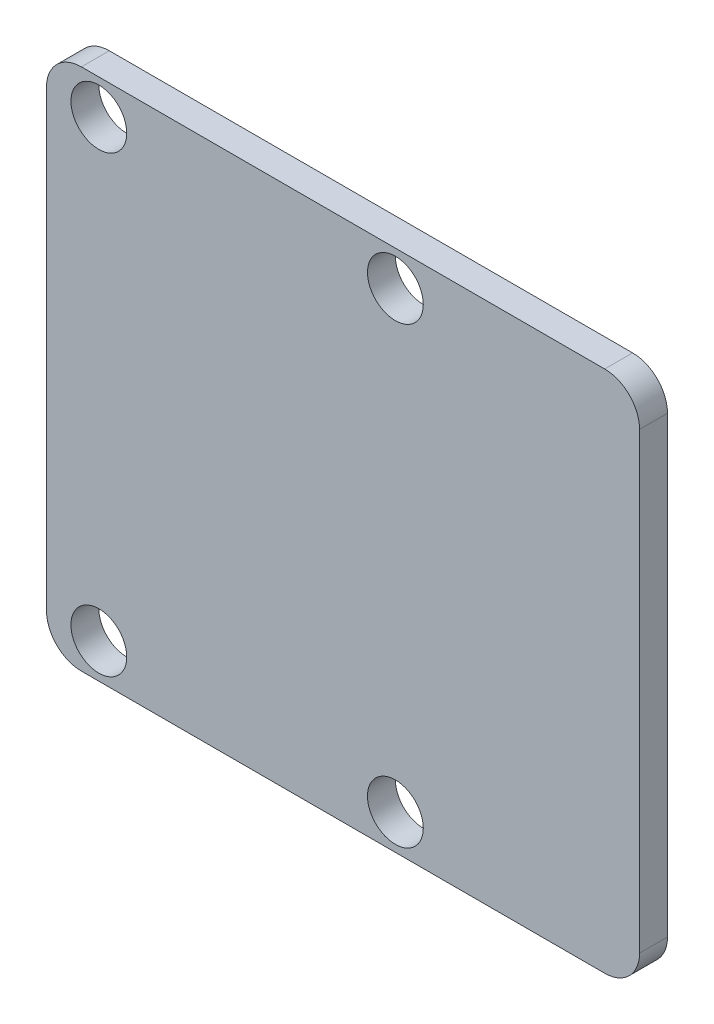
ISO-10303-21;
HEADER;
FILE_DESCRIPTION(('STEP AP214'),'2;1');
FILE_NAME('part.step','',(''),(''),'','','');
FILE_SCHEMA(('AUTOMOTIVE_DESIGN { 1 0 10303 214 1 1 1 1 }'));
ENDSEC;
DATA;
#1=APPLICATION_CONTEXT('core data for automotive mechanical design processes');
#2=APPLICATION_PROTOCOL_DEFINITION('international standard','automotive_design',2000,#1);
#3=PRODUCT_CONTEXT('',#1,'mechanical');
#4=PRODUCT('Part','Part','',(#3));
#5=PRODUCT_RELATED_PRODUCT_CATEGORY('part','',(#4));
#6=PRODUCT_DEFINITION_FORMATION('','',#4);
#7=PRODUCT_DEFINITION_CONTEXT('part definition',#1,'design');
#8=PRODUCT_DEFINITION('design','',#6,#7);
#9=PRODUCT_DEFINITION_SHAPE('','',#8);
#10=(LENGTH_UNIT() NAMED_UNIT(*) SI_UNIT(.MILLI.,.METRE.));
#11=(NAMED_UNIT(*) PLANE_ANGLE_UNIT() SI_UNIT($,.RADIAN.));
#12=(NAMED_UNIT(*) SI_UNIT($,.STERADIAN.) SOLID_ANGLE_UNIT());
#13=UNCERTAINTY_MEASURE_WITH_UNIT(LENGTH_MEASURE(1.E-05),#10,'distance_accuracy_value','');
#14=(GEOMETRIC_REPRESENTATION_CONTEXT(3) GLOBAL_UNCERTAINTY_ASSIGNED_CONTEXT((#13)) GLOBAL_UNIT_ASSIGNED_CONTEXT((#10,
#11,#12)) REPRESENTATION_CONTEXT('',''));
#15=CARTESIAN_POINT('',(0.,0.,0.));
#16=DIRECTION('',(0.,0.,1.));
#17=DIRECTION('',(1.,0.,0.));
#18=AXIS2_PLACEMENT_3D('',#15,#16,#17);
#19=CARTESIAN_POINT('',(17.,15.,1.6));
#20=DIRECTION('',(-1.,0.,0.));
#21=DIRECTION('',(0.,0.,1.));
#22=AXIS2_PLACEMENT_3D('',#19,#20,#21);
#23=PLANE('',#22);
#24=DIRECTION('',(0.,1.,0.));
#25=VECTOR('',#24,1.);
#26=CARTESIAN_POINT('',(17.,15.,0.));
#27=LINE('',#26,#25);
#28=CARTESIAN_POINT('',(17.,-13.,0.));
#29=VERTEX_POINT('',#28);
#30=CARTESIAN_POINT('',(17.,13.,0.));
#31=VERTEX_POINT('',#30);
#32=EDGE_CURVE('E126',#29,#31,#27,.T.);
#33=ORIENTED_EDGE('',*,*,#32,.T.);
#34=DIRECTION('',(0.,0.,-1.));
#35=VECTOR('',#34,1.);
#36=CARTESIAN_POINT('',(17.,13.,1.6));
#37=LINE('',#36,#35);
#38=CARTESIAN_POINT('',(17.,13.,1.6));
#39=VERTEX_POINT('',#38);
#40=EDGE_CURVE('E104',#31,#39,#37,.F.);
#41=ORIENTED_EDGE('',*,*,#40,.T.);
#42=DIRECTION('',(0.,1.,0.));
#43=VECTOR('',#42,1.);
#44=CARTESIAN_POINT('',(17.,15.,1.6));
#45=LINE('',#44,#43);
#46=CARTESIAN_POINT('',(17.,-13.,1.6));
#47=VERTEX_POINT('',#46);
#48=EDGE_CURVE('E136',#47,#39,#45,.T.);
#49=ORIENTED_EDGE('',*,*,#48,.F.);
#50=DIRECTION('',(0.,0.,-1.));
#51=VECTOR('',#50,1.);
#52=CARTESIAN_POINT('',(17.,-13.,1.6));
#53=LINE('',#52,#51);
#54=EDGE_CURVE('E109',#47,#29,#53,.T.);
#55=ORIENTED_EDGE('',*,*,#54,.T.);
#56=EDGE_LOOP('',(#33,#41,#49,#55));
#57=FACE_BOUND('',#56,.T.);
#58=ADVANCED_FACE('F33',(#57),#23,.F.);
#59=CARTESIAN_POINT('',(-17.,15.,1.6));
#60=DIRECTION('',(0.,-1.,0.));
#61=DIRECTION('',(0.,0.,-1.));
#62=AXIS2_PLACEMENT_3D('',#59,#60,#61);
#63=PLANE('',#62);
#64=DIRECTION('',(-1.,0.,0.));
#65=VECTOR('',#64,1.);
#66=CARTESIAN_POINT('',(-17.,15.,1.6));
#67=LINE('',#66,#65);
#68=CARTESIAN_POINT('',(15.,15.,1.6));
#69=VERTEX_POINT('',#68);
#70=CARTESIAN_POINT('',(-15.,15.,1.6));
#71=VERTEX_POINT('',#70);
#72=EDGE_CURVE('E119',#69,#71,#67,.T.);
#73=ORIENTED_EDGE('',*,*,#72,.F.);
#74=DIRECTION('',(0.,0.,-1.));
#75=VECTOR('',#74,1.);
#76=CARTESIAN_POINT('',(15.,15.,1.6));
#77=LINE('',#76,#75);
#78=CARTESIAN_POINT('',(15.,15.,0.));
#79=VERTEX_POINT('',#78);
#80=EDGE_CURVE('E103',#69,#79,#77,.T.);
#81=ORIENTED_EDGE('',*,*,#80,.T.);
#82=DIRECTION('',(-1.,0.,0.));
#83=VECTOR('',#82,1.);
#84=CARTESIAN_POINT('',(-17.,15.,0.));
#85=LINE('',#84,#83);
#86=CARTESIAN_POINT('',(-15.,15.,0.));
#87=VERTEX_POINT('',#86);
#88=EDGE_CURVE('E116',#79,#87,#85,.T.);
#89=ORIENTED_EDGE('',*,*,#88,.T.);
#90=DIRECTION('',(0.,0.,-1.));
#91=VECTOR('',#90,1.);
#92=CARTESIAN_POINT('',(-15.,15.,1.6));
#93=LINE('',#92,#91);
#94=EDGE_CURVE('E121',#87,#71,#93,.F.);
#95=ORIENTED_EDGE('',*,*,#94,.T.);
#96=EDGE_LOOP('',(#73,#81,#89,#95));
#97=FACE_BOUND('',#96,.T.);
#98=ADVANCED_FACE('F115',(#97),#63,.F.);
#99=CARTESIAN_POINT('',(-17.,15.,1.6));
#100=DIRECTION('',(1.,0.,0.));
#101=DIRECTION('',(0.,1.,0.));
#102=AXIS2_PLACEMENT_3D('',#99,#100,#101);
#103=PLANE('',#102);
#104=DIRECTION('',(0.,-1.,0.));
#105=VECTOR('',#104,1.);
#106=CARTESIAN_POINT('',(-17.,15.,0.));
#107=LINE('',#106,#105);
#108=CARTESIAN_POINT('',(-17.,13.,0.));
#109=VERTEX_POINT('',#108);
#110=CARTESIAN_POINT('',(-17.,-13.,0.));
#111=VERTEX_POINT('',#110);
#112=EDGE_CURVE('E125',#109,#111,#107,.T.);
#113=ORIENTED_EDGE('',*,*,#112,.T.);
#114=DIRECTION('',(0.,0.,-1.));
#115=VECTOR('',#114,1.);
#116=CARTESIAN_POINT('',(-17.,-13.,1.6));
#117=LINE('',#116,#115);
#118=CARTESIAN_POINT('',(-17.,-13.,1.6));
#119=VERTEX_POINT('',#118);
#120=EDGE_CURVE('E11',#111,#119,#117,.F.);
#121=ORIENTED_EDGE('',*,*,#120,.T.);
#122=DIRECTION('',(0.,-1.,0.));
#123=VECTOR('',#122,1.);
#124=CARTESIAN_POINT('',(-17.,15.,1.6));
#125=LINE('',#124,#123);
#126=CARTESIAN_POINT('',(-17.,13.,1.6));
#127=VERTEX_POINT('',#126);
#128=EDGE_CURVE('E162',#127,#119,#125,.T.);
#129=ORIENTED_EDGE('',*,*,#128,.F.);
#130=DIRECTION('',(0.,0.,-1.));
#131=VECTOR('',#130,1.);
#132=CARTESIAN_POINT('',(-17.,13.,1.6));
#133=LINE('',#132,#131);
#134=EDGE_CURVE('E41',#127,#109,#133,.T.);
#135=ORIENTED_EDGE('',*,*,#134,.T.);
#136=EDGE_LOOP('',(#113,#121,#129,#135));
#137=FACE_BOUND('',#136,.T.);
#138=ADVANCED_FACE('F160',(#137),#103,.F.);
#139=CARTESIAN_POINT('',(-17.,-15.,1.6));
#140=DIRECTION('',(0.,1.,0.));
#141=DIRECTION('',(0.,0.,1.));
#142=AXIS2_PLACEMENT_3D('',#139,#140,#141);
#143=PLANE('',#142);
#144=DIRECTION('',(1.,0.,0.));
#145=VECTOR('',#144,1.);
#146=CARTESIAN_POINT('',(-17.,-15.,0.));
#147=LINE('',#146,#145);
#148=CARTESIAN_POINT('',(-15.,-15.,0.));
#149=VERTEX_POINT('',#148);
#150=CARTESIAN_POINT('',(15.,-15.,0.));
#151=VERTEX_POINT('',#150);
#152=EDGE_CURVE('E129',#149,#151,#147,.T.);
#153=ORIENTED_EDGE('',*,*,#152,.T.);
#154=DIRECTION('',(0.,0.,-1.));
#155=VECTOR('',#154,1.);
#156=CARTESIAN_POINT('',(15.,-15.,1.6));
#157=LINE('',#156,#155);
#158=CARTESIAN_POINT('',(15.,-15.,1.6));
#159=VERTEX_POINT('',#158);
#160=EDGE_CURVE('E48',#151,#159,#157,.F.);
#161=ORIENTED_EDGE('',*,*,#160,.T.);
#162=DIRECTION('',(1.,0.,0.));
#163=VECTOR('',#162,1.);
#164=CARTESIAN_POINT('',(-17.,-15.,1.6));
#165=LINE('',#164,#163);
#166=CARTESIAN_POINT('',(-15.,-15.,1.6));
#167=VERTEX_POINT('',#166);
#168=EDGE_CURVE('E137',#167,#159,#165,.T.);
#169=ORIENTED_EDGE('',*,*,#168,.F.);
#170=DIRECTION('',(0.,0.,-1.));
#171=VECTOR('',#170,1.);
#172=CARTESIAN_POINT('',(-15.,-15.,1.6));
#173=LINE('',#172,#171);
#174=EDGE_CURVE('E153',#167,#149,#173,.T.);
#175=ORIENTED_EDGE('',*,*,#174,.T.);
#176=EDGE_LOOP('',(#153,#161,#169,#175));
#177=FACE_BOUND('',#176,.T.);
#178=ADVANCED_FACE('F169',(#177),#143,.F.);
#179=CARTESIAN_POINT('',(0.,0.,1.6));
#180=DIRECTION('',(0.,0.,1.));
#181=DIRECTION('',(1.,0.,0.));
#182=AXIS2_PLACEMENT_3D('',#179,#180,#181);
#183=PLANE('',#182);
#184=CARTESIAN_POINT('',(-14.,-13.,1.6));
#185=DIRECTION('',(0.,0.,1.));
#186=DIRECTION('',(1.,0.,0.));
#187=AXIS2_PLACEMENT_3D('',#184,#185,#186);
#188=CIRCLE('',#187,1.6);
#189=CARTESIAN_POINT('',(-12.4,-13.,1.6));
#190=VERTEX_POINT('',#189);
#191=EDGE_CURVE('E182',#190,#190,#188,.T.);
#192=ORIENTED_EDGE('',*,*,#191,.F.);
#193=EDGE_LOOP('',(#192));
#194=FACE_BOUND('',#193,.T.);
#195=CARTESIAN_POINT('',(3.,-13.,1.6));
#196=DIRECTION('',(0.,0.,1.));
#197=DIRECTION('',(1.,0.,0.));
#198=AXIS2_PLACEMENT_3D('',#195,#196,#197);
#199=CIRCLE('',#198,1.6);
#200=CARTESIAN_POINT('',(4.6,-13.,1.6));
#201=VERTEX_POINT('',#200);
#202=EDGE_CURVE('E189',#201,#201,#199,.T.);
#203=ORIENTED_EDGE('',*,*,#202,.F.);
#204=EDGE_LOOP('',(#203));
#205=FACE_BOUND('',#204,.T.);
#206=CARTESIAN_POINT('',(3.,13.,1.6));
#207=DIRECTION('',(0.,0.,1.));
#208=DIRECTION('',(1.,0.,0.));
#209=AXIS2_PLACEMENT_3D('',#206,#207,#208);
#210=CIRCLE('',#209,1.6);
#211=CARTESIAN_POINT('',(4.6,13.,1.6));
#212=VERTEX_POINT('',#211);
#213=EDGE_CURVE('E181',#212,#212,#210,.T.);
#214=ORIENTED_EDGE('',*,*,#213,.F.);
#215=EDGE_LOOP('',(#214));
#216=FACE_BOUND('',#215,.T.);
#217=CARTESIAN_POINT('',(-14.,13.,1.6));
#218=DIRECTION('',(0.,0.,1.));
#219=DIRECTION('',(1.,0.,0.));
#220=AXIS2_PLACEMENT_3D('',#217,#218,#219);
#221=CIRCLE('',#220,1.6);
#222=CARTESIAN_POINT('',(-12.4,13.,1.6));
#223=VERTEX_POINT('',#222);
#224=EDGE_CURVE('E131',#223,#223,#221,.T.);
#225=ORIENTED_EDGE('',*,*,#224,.F.);
#226=EDGE_LOOP('',(#225));
#227=FACE_BOUND('',#226,.T.);
#228=ORIENTED_EDGE('',*,*,#48,.T.);
#229=CARTESIAN_POINT('',(15.,13.,1.6));
#230=DIRECTION('',(0.,0.,1.));
#231=DIRECTION('',(1.,0.,0.));
#232=AXIS2_PLACEMENT_3D('',#229,#230,#231);
#233=CIRCLE('',#232,2.);
#234=EDGE_CURVE('E151',#39,#69,#233,.T.);
#235=ORIENTED_EDGE('',*,*,#234,.T.);
#236=ORIENTED_EDGE('',*,*,#72,.T.);
#237=CARTESIAN_POINT('',(-15.,13.,1.6));
#238=DIRECTION('',(0.,0.,1.));
#239=DIRECTION('',(1.,0.,0.));
#240=AXIS2_PLACEMENT_3D('',#237,#238,#239);
#241=CIRCLE('',#240,2.);
#242=EDGE_CURVE('E146',#71,#127,#241,.T.);
#243=ORIENTED_EDGE('',*,*,#242,.T.);
#244=ORIENTED_EDGE('',*,*,#128,.T.);
#245=CARTESIAN_POINT('',(-15.,-13.,1.6));
#246=DIRECTION('',(0.,0.,1.));
#247=DIRECTION('',(1.,0.,0.));
#248=AXIS2_PLACEMENT_3D('',#245,#246,#247);
#249=CIRCLE('',#248,2.);
#250=EDGE_CURVE('E55',#119,#167,#249,.T.);
#251=ORIENTED_EDGE('',*,*,#250,.T.);
#252=ORIENTED_EDGE('',*,*,#168,.T.);
#253=CARTESIAN_POINT('',(15.,-13.,1.6));
#254=DIRECTION('',(0.,0.,1.));
#255=DIRECTION('',(1.,0.,0.));
#256=AXIS2_PLACEMENT_3D('',#253,#254,#255);
#257=CIRCLE('',#256,2.);
#258=EDGE_CURVE('E149',#159,#47,#257,.T.);
#259=ORIENTED_EDGE('',*,*,#258,.T.);
#260=EDGE_LOOP('',(#228,#235,#236,#243,#244,#251,#252,#259));
#261=FACE_BOUND('',#260,.T.);
#262=ADVANCED_FACE('F238',(#194,#205,#216,#227,#261),#183,.T.);
#263=CARTESIAN_POINT('',(0.,0.,0.));
#264=DIRECTION('',(0.,0.,1.));
#265=DIRECTION('',(1.,0.,0.));
#266=AXIS2_PLACEMENT_3D('',#263,#264,#265);
#267=PLANE('',#266);
#268=CARTESIAN_POINT('',(-14.,-13.,0.));
#269=DIRECTION('',(0.,0.,1.));
#270=DIRECTION('',(1.,0.,0.));
#271=AXIS2_PLACEMENT_3D('',#268,#269,#270);
#272=CIRCLE('',#271,1.6);
#273=CARTESIAN_POINT('',(-12.4,-13.,0.));
#274=VERTEX_POINT('',#273);
#275=EDGE_CURVE('E186',#274,#274,#272,.T.);
#276=ORIENTED_EDGE('',*,*,#275,.T.);
#277=EDGE_LOOP('',(#276));
#278=FACE_BOUND('',#277,.T.);
#279=CARTESIAN_POINT('',(3.,-13.,0.));
#280=DIRECTION('',(0.,0.,1.));
#281=DIRECTION('',(1.,0.,0.));
#282=AXIS2_PLACEMENT_3D('',#279,#280,#281);
#283=CIRCLE('',#282,1.6);
#284=CARTESIAN_POINT('',(4.6,-13.,0.));
#285=VERTEX_POINT('',#284);
#286=EDGE_CURVE('E185',#285,#285,#283,.T.);
#287=ORIENTED_EDGE('',*,*,#286,.T.);
#288=EDGE_LOOP('',(#287));
#289=FACE_BOUND('',#288,.T.);
#290=CARTESIAN_POINT('',(3.,13.,0.));
#291=DIRECTION('',(0.,0.,1.));
#292=DIRECTION('',(1.,0.,0.));
#293=AXIS2_PLACEMENT_3D('',#290,#291,#292);
#294=CIRCLE('',#293,1.6);
#295=CARTESIAN_POINT('',(4.6,13.,0.));
#296=VERTEX_POINT('',#295);
#297=EDGE_CURVE('E192',#296,#296,#294,.T.);
#298=ORIENTED_EDGE('',*,*,#297,.T.);
#299=EDGE_LOOP('',(#298));
#300=FACE_BOUND('',#299,.T.);
#301=CARTESIAN_POINT('',(-14.,13.,0.));
#302=DIRECTION('',(0.,0.,1.));
#303=DIRECTION('',(1.,0.,0.));
#304=AXIS2_PLACEMENT_3D('',#301,#302,#303);
#305=CIRCLE('',#304,1.6);
#306=CARTESIAN_POINT('',(-12.4,13.,0.));
#307=VERTEX_POINT('',#306);
#308=EDGE_CURVE('E178',#307,#307,#305,.T.);
#309=ORIENTED_EDGE('',*,*,#308,.T.);
#310=EDGE_LOOP('',(#309));
#311=FACE_BOUND('',#310,.T.);
#312=ORIENTED_EDGE('',*,*,#88,.F.);
#313=CARTESIAN_POINT('',(15.,13.,0.));
#314=DIRECTION('',(0.,0.,1.));
#315=DIRECTION('',(1.,0.,0.));
#316=AXIS2_PLACEMENT_3D('',#313,#314,#315);
#317=CIRCLE('',#316,2.);
#318=EDGE_CURVE('E99',#79,#31,#317,.F.);
#319=ORIENTED_EDGE('',*,*,#318,.T.);
#320=ORIENTED_EDGE('',*,*,#32,.F.);
#321=CARTESIAN_POINT('',(15.,-13.,0.));
#322=DIRECTION('',(0.,0.,1.));
#323=DIRECTION('',(1.,0.,0.));
#324=AXIS2_PLACEMENT_3D('',#321,#322,#323);
#325=CIRCLE('',#324,2.);
#326=EDGE_CURVE('E110',#29,#151,#325,.F.);
#327=ORIENTED_EDGE('',*,*,#326,.T.);
#328=ORIENTED_EDGE('',*,*,#152,.F.);
#329=CARTESIAN_POINT('',(-15.,-13.,0.));
#330=DIRECTION('',(0.,0.,1.));
#331=DIRECTION('',(1.,0.,0.));
#332=AXIS2_PLACEMENT_3D('',#329,#330,#331);
#333=CIRCLE('',#332,2.);
#334=EDGE_CURVE('E140',#149,#111,#333,.F.);
#335=ORIENTED_EDGE('',*,*,#334,.T.);
#336=ORIENTED_EDGE('',*,*,#112,.F.);
#337=CARTESIAN_POINT('',(-15.,13.,0.));
#338=DIRECTION('',(0.,0.,1.));
#339=DIRECTION('',(1.,0.,0.));
#340=AXIS2_PLACEMENT_3D('',#337,#338,#339);
#341=CIRCLE('',#340,2.);
#342=EDGE_CURVE('E120',#109,#87,#341,.F.);
#343=ORIENTED_EDGE('',*,*,#342,.T.);
#344=EDGE_LOOP('',(#312,#319,#320,#327,#328,#335,#336,#343));
#345=FACE_BOUND('',#344,.T.);
#346=ADVANCED_FACE('F123',(#278,#289,#300,#311,#345),#267,.F.);
#347=CARTESIAN_POINT('',(-14.,13.,1.601));
#348=DIRECTION('',(0.,0.,-1.));
#349=DIRECTION('',(-1.,0.,0.));
#350=AXIS2_PLACEMENT_3D('',#347,#348,#349);
#351=CYLINDRICAL_SURFACE('',#350,1.6);
#352=ORIENTED_EDGE('',*,*,#224,.T.);
#353=EDGE_LOOP('',(#352));
#354=FACE_BOUND('',#353,.T.);
#355=ORIENTED_EDGE('',*,*,#308,.F.);
#356=EDGE_LOOP('',(#355));
#357=FACE_BOUND('',#356,.T.);
#358=ADVANCED_FACE('F205',(#354,#357),#351,.F.);
#359=CARTESIAN_POINT('',(3.,13.,1.601));
#360=DIRECTION('',(0.,0.,-1.));
#361=DIRECTION('',(-1.,0.,0.));
#362=AXIS2_PLACEMENT_3D('',#359,#360,#361);
#363=CYLINDRICAL_SURFACE('',#362,1.6);
#364=ORIENTED_EDGE('',*,*,#213,.T.);
#365=EDGE_LOOP('',(#364));
#366=FACE_BOUND('',#365,.T.);
#367=ORIENTED_EDGE('',*,*,#297,.F.);
#368=EDGE_LOOP('',(#367));
#369=FACE_BOUND('',#368,.T.);
#370=ADVANCED_FACE('F202',(#366,#369),#363,.F.);
#371=CARTESIAN_POINT('',(3.,-13.,1.601));
#372=DIRECTION('',(0.,0.,-1.));
#373=DIRECTION('',(-1.,0.,0.));
#374=AXIS2_PLACEMENT_3D('',#371,#372,#373);
#375=CYLINDRICAL_SURFACE('',#374,1.6);
#376=ORIENTED_EDGE('',*,*,#202,.T.);
#377=EDGE_LOOP('',(#376));
#378=FACE_BOUND('',#377,.T.);
#379=ORIENTED_EDGE('',*,*,#286,.F.);
#380=EDGE_LOOP('',(#379));
#381=FACE_BOUND('',#380,.T.);
#382=ADVANCED_FACE('F204',(#378,#381),#375,.F.);
#383=CARTESIAN_POINT('',(-14.,-13.,1.601));
#384=DIRECTION('',(0.,0.,-1.));
#385=DIRECTION('',(-1.,0.,0.));
#386=AXIS2_PLACEMENT_3D('',#383,#384,#385);
#387=CYLINDRICAL_SURFACE('',#386,1.6);
#388=ORIENTED_EDGE('',*,*,#191,.T.);
#389=EDGE_LOOP('',(#388));
#390=FACE_BOUND('',#389,.T.);
#391=ORIENTED_EDGE('',*,*,#275,.F.);
#392=EDGE_LOOP('',(#391));
#393=FACE_BOUND('',#392,.T.);
#394=ADVANCED_FACE('F212',(#390,#393),#387,.F.);
#395=CARTESIAN_POINT('',(15.,13.,1.6));
#396=DIRECTION('',(0.,0.,-1.));
#397=DIRECTION('',(-1.,0.,0.));
#398=AXIS2_PLACEMENT_3D('',#395,#396,#397);
#399=CYLINDRICAL_SURFACE('',#398,2.);
#400=ORIENTED_EDGE('',*,*,#234,.F.);
#401=ORIENTED_EDGE('',*,*,#40,.F.);
#402=ORIENTED_EDGE('',*,*,#318,.F.);
#403=ORIENTED_EDGE('',*,*,#80,.F.);
#404=EDGE_LOOP('',(#400,#401,#402,#403));
#405=FACE_BOUND('',#404,.T.);
#406=ADVANCED_FACE('F102',(#405),#399,.T.);
#407=CARTESIAN_POINT('',(15.,-13.,1.6));
#408=DIRECTION('',(0.,0.,-1.));
#409=DIRECTION('',(-1.,0.,0.));
#410=AXIS2_PLACEMENT_3D('',#407,#408,#409);
#411=CYLINDRICAL_SURFACE('',#410,2.);
#412=ORIENTED_EDGE('',*,*,#258,.F.);
#413=ORIENTED_EDGE('',*,*,#160,.F.);
#414=ORIENTED_EDGE('',*,*,#326,.F.);
#415=ORIENTED_EDGE('',*,*,#54,.F.);
#416=EDGE_LOOP('',(#412,#413,#414,#415));
#417=FACE_BOUND('',#416,.T.);
#418=ADVANCED_FACE('F229',(#417),#411,.T.);
#419=CARTESIAN_POINT('',(-15.,-13.,1.6));
#420=DIRECTION('',(0.,0.,-1.));
#421=DIRECTION('',(-1.,0.,0.));
#422=AXIS2_PLACEMENT_3D('',#419,#420,#421);
#423=CYLINDRICAL_SURFACE('',#422,2.);
#424=ORIENTED_EDGE('',*,*,#250,.F.);
#425=ORIENTED_EDGE('',*,*,#120,.F.);
#426=ORIENTED_EDGE('',*,*,#334,.F.);
#427=ORIENTED_EDGE('',*,*,#174,.F.);
#428=EDGE_LOOP('',(#424,#425,#426,#427));
#429=FACE_BOUND('',#428,.T.);
#430=ADVANCED_FACE('F168',(#429),#423,.T.);
#431=CARTESIAN_POINT('',(-15.,13.,1.6));
#432=DIRECTION('',(0.,0.,-1.));
#433=DIRECTION('',(-1.,0.,0.));
#434=AXIS2_PLACEMENT_3D('',#431,#432,#433);
#435=CYLINDRICAL_SURFACE('',#434,2.);
#436=ORIENTED_EDGE('',*,*,#242,.F.);
#437=ORIENTED_EDGE('',*,*,#94,.F.);
#438=ORIENTED_EDGE('',*,*,#342,.F.);
#439=ORIENTED_EDGE('',*,*,#134,.F.);
#440=EDGE_LOOP('',(#436,#437,#438,#439));
#441=FACE_BOUND('',#440,.T.);
#442=ADVANCED_FACE('F35',(#441),#435,.T.);
#443=CLOSED_SHELL('',(#58,#98,#138,#178,#262,#346,#358,#370,#382,#394,#406,#418,#430,#442));
#444=MANIFOLD_SOLID_BREP('B2',#443);
#445=ADVANCED_BREP_SHAPE_REPRESENTATION('',(#18,#444),#14);
#446=SHAPE_DEFINITION_REPRESENTATION(#9,#445);
ENDSEC;
END-ISO-10303-21;
